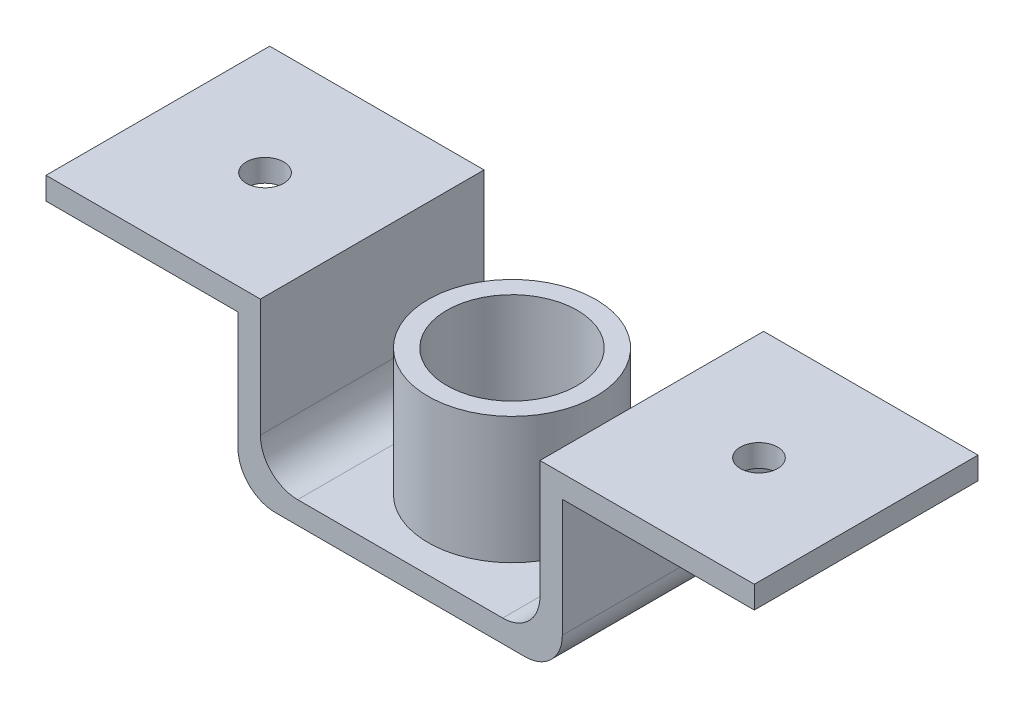
ISO-10303-21;
HEADER;
FILE_DESCRIPTION(('STEP AP214'),'2;1');
FILE_NAME('part.step','',(''),(''),'','','');
FILE_SCHEMA(('AUTOMOTIVE_DESIGN { 1 0 10303 214 1 1 1 1 }'));
ENDSEC;
DATA;
#1=APPLICATION_CONTEXT('core data for automotive mechanical design processes');
#2=APPLICATION_PROTOCOL_DEFINITION('international standard','automotive_design',2000,#1);
#3=PRODUCT_CONTEXT('',#1,'mechanical');
#4=PRODUCT('Part','Part','',(#3));
#5=PRODUCT_RELATED_PRODUCT_CATEGORY('part','',(#4));
#6=PRODUCT_DEFINITION_FORMATION('','',#4);
#7=PRODUCT_DEFINITION_CONTEXT('part definition',#1,'design');
#8=PRODUCT_DEFINITION('design','',#6,#7);
#9=PRODUCT_DEFINITION_SHAPE('','',#8);
#10=(LENGTH_UNIT() NAMED_UNIT(*) SI_UNIT(.MILLI.,.METRE.));
#11=(NAMED_UNIT(*) PLANE_ANGLE_UNIT() SI_UNIT($,.RADIAN.));
#12=(NAMED_UNIT(*) SI_UNIT($,.STERADIAN.) SOLID_ANGLE_UNIT());
#13=UNCERTAINTY_MEASURE_WITH_UNIT(LENGTH_MEASURE(1.E-05),#10,'distance_accuracy_value','');
#14=(GEOMETRIC_REPRESENTATION_CONTEXT(3) GLOBAL_UNCERTAINTY_ASSIGNED_CONTEXT((#13)) GLOBAL_UNIT_ASSIGNED_CONTEXT((#10,
#11,#12)) REPRESENTATION_CONTEXT('',''));
#15=CARTESIAN_POINT('',(0.,0.,0.));
#16=DIRECTION('',(0.,0.,1.));
#17=DIRECTION('',(1.,0.,0.));
#18=AXIS2_PLACEMENT_3D('',#15,#16,#17);
#19=CARTESIAN_POINT('',(475.,-38.,150.));
#20=DIRECTION('',(0.,-1.,0.));
#21=DIRECTION('',(0.,0.,-1.));
#22=AXIS2_PLACEMENT_3D('',#19,#20,#21);
#23=CYLINDRICAL_SURFACE('',#22,112.5);
#24=CARTESIAN_POINT('',(475.,-38.,150.));
#25=DIRECTION('',(0.,-1.,0.));
#26=DIRECTION('',(0.,0.,-1.));
#27=AXIS2_PLACEMENT_3D('',#24,#25,#26);
#28=CIRCLE('',#27,112.5);
#29=CARTESIAN_POINT('',(475.,-38.,37.5));
#30=VERTEX_POINT('',#29);
#31=EDGE_CURVE('E12',#30,#30,#28,.T.);
#32=ORIENTED_EDGE('',*,*,#31,.T.);
#33=EDGE_LOOP('',(#32));
#34=FACE_BOUND('',#33,.T.);
#35=CARTESIAN_POINT('',(475.,-208.,150.));
#36=DIRECTION('',(0.,-1.,0.));
#37=DIRECTION('',(0.,0.,-1.));
#38=AXIS2_PLACEMENT_3D('',#35,#36,#37);
#39=CIRCLE('',#38,112.5);
#40=CARTESIAN_POINT('',(475.,-208.,37.5));
#41=VERTEX_POINT('',#40);
#42=EDGE_CURVE('E50',#41,#41,#39,.T.);
#43=ORIENTED_EDGE('',*,*,#42,.F.);
#44=EDGE_LOOP('',(#43));
#45=FACE_BOUND('',#44,.T.);
#46=ADVANCED_FACE('F47',(#34,#45),#23,.T.);
#47=CARTESIAN_POINT('',(475.,-38.,150.));
#48=DIRECTION('',(0.,-1.,0.));
#49=DIRECTION('',(0.,0.,-1.));
#50=AXIS2_PLACEMENT_3D('',#47,#48,#49);
#51=PLANE('',#50);
#52=CARTESIAN_POINT('',(475.,-38.,150.));
#53=DIRECTION('',(0.,-1.,0.));
#54=DIRECTION('',(0.,0.,-1.));
#55=AXIS2_PLACEMENT_3D('',#52,#53,#54);
#56=CIRCLE('',#55,87.5);
#57=CARTESIAN_POINT('',(475.,-38.,62.5));
#58=VERTEX_POINT('',#57);
#59=EDGE_CURVE('E57',#58,#58,#56,.T.);
#60=ORIENTED_EDGE('',*,*,#59,.T.);
#61=EDGE_LOOP('',(#60));
#62=FACE_BOUND('',#61,.T.);
#63=ORIENTED_EDGE('',*,*,#31,.F.);
#64=EDGE_LOOP('',(#63));
#65=FACE_BOUND('',#64,.T.);
#66=ADVANCED_FACE('F65',(#62,#65),#51,.F.);
#67=CARTESIAN_POINT('',(475.,-208.,150.));
#68=DIRECTION('',(0.,-1.,0.));
#69=DIRECTION('',(0.,0.,-1.));
#70=AXIS2_PLACEMENT_3D('',#67,#68,#69);
#71=PLANE('',#70);
#72=CARTESIAN_POINT('',(475.,-208.,150.));
#73=DIRECTION('',(0.,-1.,0.));
#74=DIRECTION('',(0.,0.,-1.));
#75=AXIS2_PLACEMENT_3D('',#72,#73,#74);
#76=CIRCLE('',#75,87.5);
#77=CARTESIAN_POINT('',(475.,-208.,62.5));
#78=VERTEX_POINT('',#77);
#79=EDGE_CURVE('E59',#78,#78,#76,.T.);
#80=ORIENTED_EDGE('',*,*,#79,.F.);
#81=EDGE_LOOP('',(#80));
#82=FACE_BOUND('',#81,.T.);
#83=ORIENTED_EDGE('',*,*,#42,.T.);
#84=EDGE_LOOP('',(#83));
#85=FACE_BOUND('',#84,.T.);
#86=ADVANCED_FACE('F71',(#82,#85),#71,.T.);
#87=CARTESIAN_POINT('',(475.,-38.,150.));
#88=DIRECTION('',(0.,-1.,0.));
#89=DIRECTION('',(0.,0.,-1.));
#90=AXIS2_PLACEMENT_3D('',#87,#88,#89);
#91=CYLINDRICAL_SURFACE('',#90,87.5);
#92=ORIENTED_EDGE('',*,*,#59,.F.);
#93=EDGE_LOOP('',(#92));
#94=FACE_BOUND('',#93,.T.);
#95=ORIENTED_EDGE('',*,*,#79,.T.);
#96=EDGE_LOOP('',(#95));
#97=FACE_BOUND('',#96,.T.);
#98=ADVANCED_FACE('F68',(#94,#97),#91,.F.);
#99=CLOSED_SHELL('',(#46,#66,#86,#98));
#100=MANIFOLD_SOLID_BREP('B2',#99);
#101=CARTESIAN_POINT('',(0.,0.,300.));
#102=DIRECTION('',(1.,0.,0.));
#103=DIRECTION('',(0.,0.,-1.));
#104=AXIS2_PLACEMENT_3D('',#101,#102,#103);
#105=PLANE('',#104);
#106=DIRECTION('',(0.,-1.,0.));
#107=VECTOR('',#106,1.);
#108=CARTESIAN_POINT('',(0.,0.,0.));
#109=LINE('',#108,#107);
#110=CARTESIAN_POINT('',(0.,0.,0.));
#111=VERTEX_POINT('',#110);
#112=CARTESIAN_POINT('',(0.,-30.,0.));
#113=VERTEX_POINT('',#112);
#114=EDGE_CURVE('E254',#111,#113,#109,.T.);
#115=ORIENTED_EDGE('',*,*,#114,.T.);
#116=DIRECTION('',(0.,0.,-1.));
#117=VECTOR('',#116,1.);
#118=CARTESIAN_POINT('',(0.,-30.,300.));
#119=LINE('',#118,#117);
#120=CARTESIAN_POINT('',(0.,-30.,300.));
#121=VERTEX_POINT('',#120);
#122=EDGE_CURVE('E45',#121,#113,#119,.T.);
#123=ORIENTED_EDGE('',*,*,#122,.F.);
#124=DIRECTION('',(0.,-1.,0.));
#125=VECTOR('',#124,1.);
#126=CARTESIAN_POINT('',(0.,0.,300.));
#127=LINE('',#126,#125);
#128=CARTESIAN_POINT('',(0.,0.,300.));
#129=VERTEX_POINT('',#128);
#130=EDGE_CURVE('E285',#129,#121,#127,.T.);
#131=ORIENTED_EDGE('',*,*,#130,.F.);
#132=DIRECTION('',(0.,0.,-1.));
#133=VECTOR('',#132,1.);
#134=CARTESIAN_POINT('',(0.,0.,300.));
#135=LINE('',#134,#133);
#136=EDGE_CURVE('E250',#129,#111,#135,.T.);
#137=ORIENTED_EDGE('',*,*,#136,.T.);
#138=EDGE_LOOP('',(#115,#123,#131,#137));
#139=FACE_BOUND('',#138,.T.);
#140=ADVANCED_FACE('F109',(#139),#105,.F.);
#141=CARTESIAN_POINT('',(0.,-30.,300.));
#142=DIRECTION('',(0.,1.,0.));
#143=DIRECTION('',(0.,0.,1.));
#144=AXIS2_PLACEMENT_3D('',#141,#142,#143);
#145=PLANE('',#144);
#146=CARTESIAN_POINT('',(143.75,-30.,150.));
#147=DIRECTION('',(0.,1.,0.));
#148=DIRECTION('',(0.,0.,1.));
#149=AXIS2_PLACEMENT_3D('',#146,#147,#148);
#150=CIRCLE('',#149,25.);
#151=CARTESIAN_POINT('',(143.75,-30.,175.));
#152=VERTEX_POINT('',#151);
#153=EDGE_CURVE('E539',#152,#152,#150,.T.);
#154=ORIENTED_EDGE('',*,*,#153,.T.);
#155=EDGE_LOOP('',(#154));
#156=FACE_BOUND('',#155,.T.);
#157=DIRECTION('',(1.,0.,0.));
#158=VECTOR('',#157,1.);
#159=CARTESIAN_POINT('',(0.,-30.,0.));
#160=LINE('',#159,#158);
#161=CARTESIAN_POINT('',(257.5,-30.,0.));
#162=VERTEX_POINT('',#161);
#163=EDGE_CURVE('E257',#113,#162,#160,.T.);
#164=ORIENTED_EDGE('',*,*,#163,.T.);
#165=DIRECTION('',(0.,0.,-1.));
#166=VECTOR('',#165,1.);
#167=CARTESIAN_POINT('',(257.5,-30.,300.));
#168=LINE('',#167,#166);
#169=CARTESIAN_POINT('',(257.5,-30.,300.));
#170=VERTEX_POINT('',#169);
#171=EDGE_CURVE('E118',#170,#162,#168,.T.);
#172=ORIENTED_EDGE('',*,*,#171,.F.);
#173=DIRECTION('',(1.,0.,0.));
#174=VECTOR('',#173,1.);
#175=CARTESIAN_POINT('',(0.,-30.,300.));
#176=LINE('',#175,#174);
#177=EDGE_CURVE('E193',#121,#170,#176,.T.);
#178=ORIENTED_EDGE('',*,*,#177,.F.);
#179=ORIENTED_EDGE('',*,*,#122,.T.);
#180=EDGE_LOOP('',(#164,#172,#178,#179));
#181=FACE_BOUND('',#180,.T.);
#182=ADVANCED_FACE('F386',(#156,#181),#145,.F.);
#183=CARTESIAN_POINT('',(257.5,-30.,300.));
#184=DIRECTION('',(1.,0.,0.));
#185=DIRECTION('',(0.,1.,0.));
#186=AXIS2_PLACEMENT_3D('',#183,#184,#185);
#187=PLANE('',#186);
#188=DIRECTION('',(0.,-1.,0.));
#189=VECTOR('',#188,1.);
#190=CARTESIAN_POINT('',(257.5,-30.,0.));
#191=LINE('',#190,#189);
#192=CARTESIAN_POINT('',(257.5,-188.,0.));
#193=VERTEX_POINT('',#192);
#194=EDGE_CURVE('E260',#162,#193,#191,.T.);
#195=ORIENTED_EDGE('',*,*,#194,.T.);
#196=DIRECTION('',(0.,0.,-1.));
#197=VECTOR('',#196,1.);
#198=CARTESIAN_POINT('',(257.5,-188.,300.));
#199=LINE('',#198,#197);
#200=CARTESIAN_POINT('',(257.5,-188.,300.));
#201=VERTEX_POINT('',#200);
#202=EDGE_CURVE('E316',#201,#193,#199,.T.);
#203=ORIENTED_EDGE('',*,*,#202,.F.);
#204=DIRECTION('',(0.,-1.,0.));
#205=VECTOR('',#204,1.);
#206=CARTESIAN_POINT('',(257.5,-30.,300.));
#207=LINE('',#206,#205);
#208=EDGE_CURVE('E325',#170,#201,#207,.T.);
#209=ORIENTED_EDGE('',*,*,#208,.F.);
#210=ORIENTED_EDGE('',*,*,#171,.T.);
#211=EDGE_LOOP('',(#195,#203,#209,#210));
#212=FACE_BOUND('',#211,.T.);
#213=ADVANCED_FACE('F323',(#212),#187,.F.);
#214=CARTESIAN_POINT('',(307.5,-188.,300.));
#215=DIRECTION('',(0.,0.,-1.));
#216=DIRECTION('',(-1.,0.,0.));
#217=AXIS2_PLACEMENT_3D('',#214,#215,#216);
#218=CYLINDRICAL_SURFACE('',#217,50.);
#219=CARTESIAN_POINT('',(307.5,-188.,0.));
#220=DIRECTION('',(0.,0.,1.));
#221=DIRECTION('',(1.,0.,0.));
#222=AXIS2_PLACEMENT_3D('',#219,#220,#221);
#223=CIRCLE('',#222,50.);
#224=CARTESIAN_POINT('',(307.5,-238.,0.));
#225=VERTEX_POINT('',#224);
#226=EDGE_CURVE('E262',#193,#225,#223,.T.);
#227=ORIENTED_EDGE('',*,*,#226,.T.);
#228=DIRECTION('',(0.,0.,-1.));
#229=VECTOR('',#228,1.);
#230=CARTESIAN_POINT('',(307.5,-238.,300.));
#231=LINE('',#230,#229);
#232=CARTESIAN_POINT('',(307.5,-238.,300.));
#233=VERTEX_POINT('',#232);
#234=EDGE_CURVE('E313',#233,#225,#231,.T.);
#235=ORIENTED_EDGE('',*,*,#234,.F.);
#236=CARTESIAN_POINT('',(307.5,-188.,300.));
#237=DIRECTION('',(0.,0.,1.));
#238=DIRECTION('',(1.,0.,0.));
#239=AXIS2_PLACEMENT_3D('',#236,#237,#238);
#240=CIRCLE('',#239,50.);
#241=EDGE_CURVE('E343',#201,#233,#240,.T.);
#242=ORIENTED_EDGE('',*,*,#241,.F.);
#243=ORIENTED_EDGE('',*,*,#202,.T.);
#244=EDGE_LOOP('',(#227,#235,#242,#243));
#245=FACE_BOUND('',#244,.T.);
#246=ADVANCED_FACE('F334',(#245),#218,.T.);
#247=CARTESIAN_POINT('',(307.5,-238.,300.));
#248=DIRECTION('',(0.,1.,0.));
#249=DIRECTION('',(0.,0.,1.));
#250=AXIS2_PLACEMENT_3D('',#247,#248,#249);
#251=PLANE('',#250);
#252=CARTESIAN_POINT('',(475.,-238.,150.));
#253=DIRECTION('',(0.,1.,0.));
#254=DIRECTION('',(0.,0.,1.));
#255=AXIS2_PLACEMENT_3D('',#252,#253,#254);
#256=CIRCLE('',#255,37.5);
#257=CARTESIAN_POINT('',(475.,-238.,187.5));
#258=VERTEX_POINT('',#257);
#259=EDGE_CURVE('E529',#258,#258,#256,.T.);
#260=ORIENTED_EDGE('',*,*,#259,.T.);
#261=EDGE_LOOP('',(#260));
#262=FACE_BOUND('',#261,.T.);
#263=DIRECTION('',(1.,0.,0.));
#264=VECTOR('',#263,1.);
#265=CARTESIAN_POINT('',(307.5,-238.,0.));
#266=LINE('',#265,#264);
#267=CARTESIAN_POINT('',(642.5,-238.,0.));
#268=VERTEX_POINT('',#267);
#269=EDGE_CURVE('E264',#225,#268,#266,.T.);
#270=ORIENTED_EDGE('',*,*,#269,.T.);
#271=DIRECTION('',(0.,0.,-1.));
#272=VECTOR('',#271,1.);
#273=CARTESIAN_POINT('',(642.5,-238.,300.));
#274=LINE('',#273,#272);
#275=CARTESIAN_POINT('',(642.5,-238.,300.));
#276=VERTEX_POINT('',#275);
#277=EDGE_CURVE('E310',#276,#268,#274,.T.);
#278=ORIENTED_EDGE('',*,*,#277,.F.);
#279=DIRECTION('',(1.,0.,0.));
#280=VECTOR('',#279,1.);
#281=CARTESIAN_POINT('',(307.5,-238.,300.));
#282=LINE('',#281,#280);
#283=EDGE_CURVE('E340',#233,#276,#282,.T.);
#284=ORIENTED_EDGE('',*,*,#283,.F.);
#285=ORIENTED_EDGE('',*,*,#234,.T.);
#286=EDGE_LOOP('',(#270,#278,#284,#285));
#287=FACE_BOUND('',#286,.T.);
#288=ADVANCED_FACE('F338',(#262,#287),#251,.F.);
#289=CARTESIAN_POINT('',(642.5,-188.,300.));
#290=DIRECTION('',(0.,0.,-1.));
#291=DIRECTION('',(-1.,0.,0.));
#292=AXIS2_PLACEMENT_3D('',#289,#290,#291);
#293=CYLINDRICAL_SURFACE('',#292,50.);
#294=CARTESIAN_POINT('',(642.5,-188.,0.));
#295=DIRECTION('',(0.,0.,1.));
#296=DIRECTION('',(1.,0.,0.));
#297=AXIS2_PLACEMENT_3D('',#294,#295,#296);
#298=CIRCLE('',#297,50.);
#299=CARTESIAN_POINT('',(692.5,-188.,0.));
#300=VERTEX_POINT('',#299);
#301=EDGE_CURVE('E266',#268,#300,#298,.T.);
#302=ORIENTED_EDGE('',*,*,#301,.T.);
#303=DIRECTION('',(0.,0.,-1.));
#304=VECTOR('',#303,1.);
#305=CARTESIAN_POINT('',(692.5,-188.,300.));
#306=LINE('',#305,#304);
#307=CARTESIAN_POINT('',(692.5,-188.,300.));
#308=VERTEX_POINT('',#307);
#309=EDGE_CURVE('E307',#308,#300,#306,.T.);
#310=ORIENTED_EDGE('',*,*,#309,.F.);
#311=CARTESIAN_POINT('',(642.5,-188.,300.));
#312=DIRECTION('',(0.,0.,1.));
#313=DIRECTION('',(1.,0.,0.));
#314=AXIS2_PLACEMENT_3D('',#311,#312,#313);
#315=CIRCLE('',#314,50.);
#316=EDGE_CURVE('E342',#276,#308,#315,.T.);
#317=ORIENTED_EDGE('',*,*,#316,.F.);
#318=ORIENTED_EDGE('',*,*,#277,.T.);
#319=EDGE_LOOP('',(#302,#310,#317,#318));
#320=FACE_BOUND('',#319,.T.);
#321=ADVANCED_FACE('F401',(#320),#293,.T.);
#322=CARTESIAN_POINT('',(692.5,-188.,300.));
#323=DIRECTION('',(-1.,0.,0.));
#324=DIRECTION('',(0.,-1.,0.));
#325=AXIS2_PLACEMENT_3D('',#322,#323,#324);
#326=PLANE('',#325);
#327=DIRECTION('',(0.,1.,0.));
#328=VECTOR('',#327,1.);
#329=CARTESIAN_POINT('',(692.5,-188.,0.));
#330=LINE('',#329,#328);
#331=CARTESIAN_POINT('',(692.5,-30.,0.));
#332=VERTEX_POINT('',#331);
#333=EDGE_CURVE('E268',#300,#332,#330,.T.);
#334=ORIENTED_EDGE('',*,*,#333,.T.);
#335=DIRECTION('',(0.,0.,-1.));
#336=VECTOR('',#335,1.);
#337=CARTESIAN_POINT('',(692.5,-30.,300.));
#338=LINE('',#337,#336);
#339=CARTESIAN_POINT('',(692.5,-30.,300.));
#340=VERTEX_POINT('',#339);
#341=EDGE_CURVE('E304',#340,#332,#338,.T.);
#342=ORIENTED_EDGE('',*,*,#341,.F.);
#343=DIRECTION('',(0.,1.,0.));
#344=VECTOR('',#343,1.);
#345=CARTESIAN_POINT('',(692.5,-188.,300.));
#346=LINE('',#345,#344);
#347=EDGE_CURVE('E345',#308,#340,#346,.T.);
#348=ORIENTED_EDGE('',*,*,#347,.F.);
#349=ORIENTED_EDGE('',*,*,#309,.T.);
#350=EDGE_LOOP('',(#334,#342,#348,#349));
#351=FACE_BOUND('',#350,.T.);
#352=ADVANCED_FACE('F405',(#351),#326,.F.);
#353=CARTESIAN_POINT('',(692.5,-30.,300.));
#354=DIRECTION('',(0.,1.,0.));
#355=DIRECTION('',(0.,0.,1.));
#356=AXIS2_PLACEMENT_3D('',#353,#354,#355);
#357=PLANE('',#356);
#358=CARTESIAN_POINT('',(806.25,-30.,150.));
#359=DIRECTION('',(0.,1.,0.));
#360=DIRECTION('',(0.,0.,1.));
#361=AXIS2_PLACEMENT_3D('',#358,#359,#360);
#362=CIRCLE('',#361,25.);
#363=CARTESIAN_POINT('',(806.25,-30.,175.));
#364=VERTEX_POINT('',#363);
#365=EDGE_CURVE('E258',#364,#364,#362,.F.);
#366=ORIENTED_EDGE('',*,*,#365,.F.);
#367=EDGE_LOOP('',(#366));
#368=FACE_BOUND('',#367,.T.);
#369=DIRECTION('',(1.,0.,0.));
#370=VECTOR('',#369,1.);
#371=CARTESIAN_POINT('',(692.5,-30.,0.));
#372=LINE('',#371,#370);
#373=CARTESIAN_POINT('',(950.,-30.,0.));
#374=VERTEX_POINT('',#373);
#375=EDGE_CURVE('E270',#332,#374,#372,.T.);
#376=ORIENTED_EDGE('',*,*,#375,.T.);
#377=DIRECTION('',(0.,0.,-1.));
#378=VECTOR('',#377,1.);
#379=CARTESIAN_POINT('',(950.,-30.,300.));
#380=LINE('',#379,#378);
#381=CARTESIAN_POINT('',(950.,-30.,300.));
#382=VERTEX_POINT('',#381);
#383=EDGE_CURVE('E301',#382,#374,#380,.T.);
#384=ORIENTED_EDGE('',*,*,#383,.F.);
#385=DIRECTION('',(1.,0.,0.));
#386=VECTOR('',#385,1.);
#387=CARTESIAN_POINT('',(692.5,-30.,300.));
#388=LINE('',#387,#386);
#389=EDGE_CURVE('E351',#340,#382,#388,.T.);
#390=ORIENTED_EDGE('',*,*,#389,.F.);
#391=ORIENTED_EDGE('',*,*,#341,.T.);
#392=EDGE_LOOP('',(#376,#384,#390,#391));
#393=FACE_BOUND('',#392,.T.);
#394=ADVANCED_FACE('F409',(#368,#393),#357,.F.);
#395=CARTESIAN_POINT('',(950.,0.,300.));
#396=DIRECTION('',(-1.,0.,0.));
#397=DIRECTION('',(0.,0.,1.));
#398=AXIS2_PLACEMENT_3D('',#395,#396,#397);
#399=PLANE('',#398);
#400=DIRECTION('',(0.,1.,0.));
#401=VECTOR('',#400,1.);
#402=CARTESIAN_POINT('',(950.,0.,0.));
#403=LINE('',#402,#401);
#404=CARTESIAN_POINT('',(950.,0.,0.));
#405=VERTEX_POINT('',#404);
#406=EDGE_CURVE('E272',#374,#405,#403,.T.);
#407=ORIENTED_EDGE('',*,*,#406,.T.);
#408=DIRECTION('',(0.,0.,-1.));
#409=VECTOR('',#408,1.);
#410=CARTESIAN_POINT('',(950.,0.,300.));
#411=LINE('',#410,#409);
#412=CARTESIAN_POINT('',(950.,0.,300.));
#413=VERTEX_POINT('',#412);
#414=EDGE_CURVE('E298',#413,#405,#411,.T.);
#415=ORIENTED_EDGE('',*,*,#414,.F.);
#416=DIRECTION('',(0.,1.,0.));
#417=VECTOR('',#416,1.);
#418=CARTESIAN_POINT('',(950.,0.,300.));
#419=LINE('',#418,#417);
#420=EDGE_CURVE('E353',#382,#413,#419,.T.);
#421=ORIENTED_EDGE('',*,*,#420,.F.);
#422=ORIENTED_EDGE('',*,*,#383,.T.);
#423=EDGE_LOOP('',(#407,#415,#421,#422));
#424=FACE_BOUND('',#423,.T.);
#425=ADVANCED_FACE('F413',(#424),#399,.F.);
#426=CARTESIAN_POINT('',(662.5,0.,300.));
#427=DIRECTION('',(0.,-1.,0.));
#428=DIRECTION('',(0.,0.,-1.));
#429=AXIS2_PLACEMENT_3D('',#426,#427,#428);
#430=PLANE('',#429);
#431=CARTESIAN_POINT('',(806.25,0.,150.));
#432=DIRECTION('',(0.,1.,0.));
#433=DIRECTION('',(0.,0.,1.));
#434=AXIS2_PLACEMENT_3D('',#431,#432,#433);
#435=CIRCLE('',#434,25.);
#436=CARTESIAN_POINT('',(806.25,0.,175.));
#437=VERTEX_POINT('',#436);
#438=EDGE_CURVE('E532',#437,#437,#435,.F.);
#439=ORIENTED_EDGE('',*,*,#438,.T.);
#440=EDGE_LOOP('',(#439));
#441=FACE_BOUND('',#440,.T.);
#442=DIRECTION('',(-1.,0.,0.));
#443=VECTOR('',#442,1.);
#444=CARTESIAN_POINT('',(662.5,0.,0.));
#445=LINE('',#444,#443);
#446=CARTESIAN_POINT('',(662.5,0.,0.));
#447=VERTEX_POINT('',#446);
#448=EDGE_CURVE('E274',#405,#447,#445,.T.);
#449=ORIENTED_EDGE('',*,*,#448,.T.);
#450=DIRECTION('',(0.,0.,-1.));
#451=VECTOR('',#450,1.);
#452=CARTESIAN_POINT('',(662.5,0.,300.));
#453=LINE('',#452,#451);
#454=CARTESIAN_POINT('',(662.5,0.,300.));
#455=VERTEX_POINT('',#454);
#456=EDGE_CURVE('E295',#455,#447,#453,.T.);
#457=ORIENTED_EDGE('',*,*,#456,.F.);
#458=DIRECTION('',(-1.,0.,0.));
#459=VECTOR('',#458,1.);
#460=CARTESIAN_POINT('',(662.5,0.,300.));
#461=LINE('',#460,#459);
#462=EDGE_CURVE('E355',#413,#455,#461,.T.);
#463=ORIENTED_EDGE('',*,*,#462,.F.);
#464=ORIENTED_EDGE('',*,*,#414,.T.);
#465=EDGE_LOOP('',(#449,#457,#463,#464));
#466=FACE_BOUND('',#465,.T.);
#467=ADVANCED_FACE('F417',(#441,#466),#430,.F.);
#468=CARTESIAN_POINT('',(662.5,-158.,300.));
#469=DIRECTION('',(1.,0.,0.));
#470=DIRECTION('',(0.,1.,0.));
#471=AXIS2_PLACEMENT_3D('',#468,#469,#470);
#472=PLANE('',#471);
#473=DIRECTION('',(0.,-1.,0.));
#474=VECTOR('',#473,1.);
#475=CARTESIAN_POINT('',(662.5,-158.,0.));
#476=LINE('',#475,#474);
#477=CARTESIAN_POINT('',(662.5,-158.,0.));
#478=VERTEX_POINT('',#477);
#479=EDGE_CURVE('E276',#447,#478,#476,.T.);
#480=ORIENTED_EDGE('',*,*,#479,.T.);
#481=DIRECTION('',(0.,0.,-1.));
#482=VECTOR('',#481,1.);
#483=CARTESIAN_POINT('',(662.5,-158.,300.));
#484=LINE('',#483,#482);
#485=CARTESIAN_POINT('',(662.5,-158.,300.));
#486=VERTEX_POINT('',#485);
#487=EDGE_CURVE('E292',#486,#478,#484,.T.);
#488=ORIENTED_EDGE('',*,*,#487,.F.);
#489=DIRECTION('',(0.,-1.,0.));
#490=VECTOR('',#489,1.);
#491=CARTESIAN_POINT('',(662.5,-158.,300.));
#492=LINE('',#491,#490);
#493=EDGE_CURVE('E357',#455,#486,#492,.T.);
#494=ORIENTED_EDGE('',*,*,#493,.F.);
#495=ORIENTED_EDGE('',*,*,#456,.T.);
#496=EDGE_LOOP('',(#480,#488,#494,#495));
#497=FACE_BOUND('',#496,.T.);
#498=ADVANCED_FACE('F421',(#497),#472,.F.);
#499=CARTESIAN_POINT('',(612.5,-158.,300.));
#500=DIRECTION('',(0.,0.,-1.));
#501=DIRECTION('',(-1.,0.,0.));
#502=AXIS2_PLACEMENT_3D('',#499,#500,#501);
#503=CYLINDRICAL_SURFACE('',#502,50.);
#504=CARTESIAN_POINT('',(612.5,-158.,0.));
#505=DIRECTION('',(0.,0.,-1.));
#506=DIRECTION('',(1.,0.,0.));
#507=AXIS2_PLACEMENT_3D('',#504,#505,#506);
#508=CIRCLE('',#507,50.);
#509=CARTESIAN_POINT('',(612.5,-208.,0.));
#510=VERTEX_POINT('',#509);
#511=EDGE_CURVE('E278',#478,#510,#508,.T.);
#512=ORIENTED_EDGE('',*,*,#511,.T.);
#513=DIRECTION('',(0.,0.,-1.));
#514=VECTOR('',#513,1.);
#515=CARTESIAN_POINT('',(612.5,-208.,300.));
#516=LINE('',#515,#514);
#517=CARTESIAN_POINT('',(612.5,-208.,300.));
#518=VERTEX_POINT('',#517);
#519=EDGE_CURVE('E289',#518,#510,#516,.T.);
#520=ORIENTED_EDGE('',*,*,#519,.F.);
#521=CARTESIAN_POINT('',(612.5,-158.,300.));
#522=DIRECTION('',(0.,0.,-1.));
#523=DIRECTION('',(1.,0.,0.));
#524=AXIS2_PLACEMENT_3D('',#521,#522,#523);
#525=CIRCLE('',#524,50.);
#526=EDGE_CURVE('E359',#486,#518,#525,.T.);
#527=ORIENTED_EDGE('',*,*,#526,.F.);
#528=ORIENTED_EDGE('',*,*,#487,.T.);
#529=EDGE_LOOP('',(#512,#520,#527,#528));
#530=FACE_BOUND('',#529,.T.);
#531=ADVANCED_FACE('F365',(#530),#503,.F.);
#532=CARTESIAN_POINT('',(337.5,-208.,300.));
#533=DIRECTION('',(0.,-1.,0.));
#534=DIRECTION('',(0.,0.,-1.));
#535=AXIS2_PLACEMENT_3D('',#532,#533,#534);
#536=PLANE('',#535);
#537=CARTESIAN_POINT('',(475.,-208.,150.));
#538=DIRECTION('',(0.,-1.,0.));
#539=DIRECTION('',(0.,0.,-1.));
#540=AXIS2_PLACEMENT_3D('',#537,#538,#539);
#541=CIRCLE('',#540,37.5);
#542=CARTESIAN_POINT('',(475.,-208.,112.5));
#543=VERTEX_POINT('',#542);
#544=EDGE_CURVE('E112',#543,#543,#541,.T.);
#545=ORIENTED_EDGE('',*,*,#544,.T.);
#546=EDGE_LOOP('',(#545));
#547=FACE_BOUND('',#546,.T.);
#548=DIRECTION('',(-1.,0.,0.));
#549=VECTOR('',#548,1.);
#550=CARTESIAN_POINT('',(337.5,-208.,0.));
#551=LINE('',#550,#549);
#552=CARTESIAN_POINT('',(337.5,-208.,0.));
#553=VERTEX_POINT('',#552);
#554=EDGE_CURVE('E280',#510,#553,#551,.T.);
#555=ORIENTED_EDGE('',*,*,#554,.T.);
#556=DIRECTION('',(0.,0.,-1.));
#557=VECTOR('',#556,1.);
#558=CARTESIAN_POINT('',(337.5,-208.,300.));
#559=LINE('',#558,#557);
#560=CARTESIAN_POINT('',(337.5,-208.,300.));
#561=VERTEX_POINT('',#560);
#562=EDGE_CURVE('E245',#561,#553,#559,.T.);
#563=ORIENTED_EDGE('',*,*,#562,.F.);
#564=DIRECTION('',(-1.,0.,0.));
#565=VECTOR('',#564,1.);
#566=CARTESIAN_POINT('',(337.5,-208.,300.));
#567=LINE('',#566,#565);
#568=EDGE_CURVE('E236',#518,#561,#567,.T.);
#569=ORIENTED_EDGE('',*,*,#568,.F.);
#570=ORIENTED_EDGE('',*,*,#519,.T.);
#571=EDGE_LOOP('',(#555,#563,#569,#570));
#572=FACE_BOUND('',#571,.T.);
#573=ADVANCED_FACE('F369',(#547,#572),#536,.F.);
#574=CARTESIAN_POINT('',(337.5,-158.,300.));
#575=DIRECTION('',(0.,0.,-1.));
#576=DIRECTION('',(-1.,0.,0.));
#577=AXIS2_PLACEMENT_3D('',#574,#575,#576);
#578=CYLINDRICAL_SURFACE('',#577,50.);
#579=CARTESIAN_POINT('',(337.5,-158.,0.));
#580=DIRECTION('',(0.,0.,-1.));
#581=DIRECTION('',(1.,0.,0.));
#582=AXIS2_PLACEMENT_3D('',#579,#580,#581);
#583=CIRCLE('',#582,50.);
#584=CARTESIAN_POINT('',(287.5,-158.,0.));
#585=VERTEX_POINT('',#584);
#586=EDGE_CURVE('E244',#553,#585,#583,.T.);
#587=ORIENTED_EDGE('',*,*,#586,.T.);
#588=DIRECTION('',(0.,0.,-1.));
#589=VECTOR('',#588,1.);
#590=CARTESIAN_POINT('',(287.5,-158.,300.));
#591=LINE('',#590,#589);
#592=CARTESIAN_POINT('',(287.5,-158.,300.));
#593=VERTEX_POINT('',#592);
#594=EDGE_CURVE('E241',#593,#585,#591,.T.);
#595=ORIENTED_EDGE('',*,*,#594,.F.);
#596=CARTESIAN_POINT('',(337.5,-158.,300.));
#597=DIRECTION('',(0.,0.,-1.));
#598=DIRECTION('',(1.,0.,0.));
#599=AXIS2_PLACEMENT_3D('',#596,#597,#598);
#600=CIRCLE('',#599,50.);
#601=EDGE_CURVE('E230',#561,#593,#600,.T.);
#602=ORIENTED_EDGE('',*,*,#601,.F.);
#603=ORIENTED_EDGE('',*,*,#562,.T.);
#604=EDGE_LOOP('',(#587,#595,#602,#603));
#605=FACE_BOUND('',#604,.T.);
#606=ADVANCED_FACE('F242',(#605),#578,.F.);
#607=CARTESIAN_POINT('',(287.5,0.,300.));
#608=DIRECTION('',(-1.,0.,0.));
#609=DIRECTION('',(0.,-1.,0.));
#610=AXIS2_PLACEMENT_3D('',#607,#608,#609);
#611=PLANE('',#610);
#612=DIRECTION('',(0.,1.,0.));
#613=VECTOR('',#612,1.);
#614=CARTESIAN_POINT('',(287.5,0.,0.));
#615=LINE('',#614,#613);
#616=CARTESIAN_POINT('',(287.5,0.,0.));
#617=VERTEX_POINT('',#616);
#618=EDGE_CURVE('E179',#585,#617,#615,.T.);
#619=ORIENTED_EDGE('',*,*,#618,.T.);
#620=DIRECTION('',(0.,0.,-1.));
#621=VECTOR('',#620,1.);
#622=CARTESIAN_POINT('',(287.5,0.,300.));
#623=LINE('',#622,#621);
#624=CARTESIAN_POINT('',(287.5,0.,300.));
#625=VERTEX_POINT('',#624);
#626=EDGE_CURVE('E246',#625,#617,#623,.T.);
#627=ORIENTED_EDGE('',*,*,#626,.F.);
#628=DIRECTION('',(0.,1.,0.));
#629=VECTOR('',#628,1.);
#630=CARTESIAN_POINT('',(287.5,0.,300.));
#631=LINE('',#630,#629);
#632=EDGE_CURVE('E234',#593,#625,#631,.T.);
#633=ORIENTED_EDGE('',*,*,#632,.F.);
#634=ORIENTED_EDGE('',*,*,#594,.T.);
#635=EDGE_LOOP('',(#619,#627,#633,#634));
#636=FACE_BOUND('',#635,.T.);
#637=ADVANCED_FACE('F248',(#636),#611,.F.);
#638=CARTESIAN_POINT('',(0.,0.,300.));
#639=DIRECTION('',(0.,-1.,0.));
#640=DIRECTION('',(0.,0.,-1.));
#641=AXIS2_PLACEMENT_3D('',#638,#639,#640);
#642=PLANE('',#641);
#643=CARTESIAN_POINT('',(143.75,0.,150.));
#644=DIRECTION('',(0.,1.,0.));
#645=DIRECTION('',(0.,0.,1.));
#646=AXIS2_PLACEMENT_3D('',#643,#644,#645);
#647=CIRCLE('',#646,25.);
#648=CARTESIAN_POINT('',(143.75,0.,175.));
#649=VERTEX_POINT('',#648);
#650=EDGE_CURVE('E534',#649,#649,#647,.T.);
#651=ORIENTED_EDGE('',*,*,#650,.F.);
#652=EDGE_LOOP('',(#651));
#653=FACE_BOUND('',#652,.T.);
#654=DIRECTION('',(-1.,0.,0.));
#655=VECTOR('',#654,1.);
#656=CARTESIAN_POINT('',(0.,0.,0.));
#657=LINE('',#656,#655);
#658=EDGE_CURVE('E185',#617,#111,#657,.T.);
#659=ORIENTED_EDGE('',*,*,#658,.T.);
#660=ORIENTED_EDGE('',*,*,#136,.F.);
#661=DIRECTION('',(-1.,0.,0.));
#662=VECTOR('',#661,1.);
#663=CARTESIAN_POINT('',(0.,0.,300.));
#664=LINE('',#663,#662);
#665=EDGE_CURVE('E126',#625,#129,#664,.T.);
#666=ORIENTED_EDGE('',*,*,#665,.F.);
#667=ORIENTED_EDGE('',*,*,#626,.T.);
#668=EDGE_LOOP('',(#659,#660,#666,#667));
#669=FACE_BOUND('',#668,.T.);
#670=ADVANCED_FACE('F373',(#653,#669),#642,.F.);
#671=CARTESIAN_POINT('',(307.5,-188.,300.));
#672=DIRECTION('',(0.,0.,1.));
#673=DIRECTION('',(1.,0.,0.));
#674=AXIS2_PLACEMENT_3D('',#671,#672,#673);
#675=PLANE('',#674);
#676=ORIENTED_EDGE('',*,*,#130,.T.);
#677=ORIENTED_EDGE('',*,*,#177,.T.);
#678=ORIENTED_EDGE('',*,*,#208,.T.);
#679=ORIENTED_EDGE('',*,*,#241,.T.);
#680=ORIENTED_EDGE('',*,*,#283,.T.);
#681=ORIENTED_EDGE('',*,*,#316,.T.);
#682=ORIENTED_EDGE('',*,*,#347,.T.);
#683=ORIENTED_EDGE('',*,*,#389,.T.);
#684=ORIENTED_EDGE('',*,*,#420,.T.);
#685=ORIENTED_EDGE('',*,*,#462,.T.);
#686=ORIENTED_EDGE('',*,*,#493,.T.);
#687=ORIENTED_EDGE('',*,*,#526,.T.);
#688=ORIENTED_EDGE('',*,*,#568,.T.);
#689=ORIENTED_EDGE('',*,*,#601,.T.);
#690=ORIENTED_EDGE('',*,*,#632,.T.);
#691=ORIENTED_EDGE('',*,*,#665,.T.);
#692=EDGE_LOOP('',(#676,#677,#678,#679,#680,#681,#682,#683,#684,#685,#686,#687,#688,#689,#690,#691));
#693=FACE_BOUND('',#692,.T.);
#694=ADVANCED_FACE('F232',(#693),#675,.T.);
#695=CARTESIAN_POINT('',(307.5,-188.,0.));
#696=DIRECTION('',(0.,0.,1.));
#697=DIRECTION('',(1.,0.,0.));
#698=AXIS2_PLACEMENT_3D('',#695,#696,#697);
#699=PLANE('',#698);
#700=ORIENTED_EDGE('',*,*,#114,.F.);
#701=ORIENTED_EDGE('',*,*,#658,.F.);
#702=ORIENTED_EDGE('',*,*,#618,.F.);
#703=ORIENTED_EDGE('',*,*,#586,.F.);
#704=ORIENTED_EDGE('',*,*,#554,.F.);
#705=ORIENTED_EDGE('',*,*,#511,.F.);
#706=ORIENTED_EDGE('',*,*,#479,.F.);
#707=ORIENTED_EDGE('',*,*,#448,.F.);
#708=ORIENTED_EDGE('',*,*,#406,.F.);
#709=ORIENTED_EDGE('',*,*,#375,.F.);
#710=ORIENTED_EDGE('',*,*,#333,.F.);
#711=ORIENTED_EDGE('',*,*,#301,.F.);
#712=ORIENTED_EDGE('',*,*,#269,.F.);
#713=ORIENTED_EDGE('',*,*,#226,.F.);
#714=ORIENTED_EDGE('',*,*,#194,.F.);
#715=ORIENTED_EDGE('',*,*,#163,.F.);
#716=EDGE_LOOP('',(#700,#701,#702,#703,#704,#705,#706,#707,#708,#709,#710,#711,#712,#713,#714,#715));
#717=FACE_BOUND('',#716,.T.);
#718=ADVANCED_FACE('F329',(#717),#699,.F.);
#719=CARTESIAN_POINT('',(143.75,-238.,150.));
#720=DIRECTION('',(0.,1.,0.));
#721=DIRECTION('',(0.,0.,1.));
#722=AXIS2_PLACEMENT_3D('',#719,#720,#721);
#723=CYLINDRICAL_SURFACE('',#722,25.);
#724=ORIENTED_EDGE('',*,*,#650,.T.);
#725=EDGE_LOOP('',(#724));
#726=FACE_BOUND('',#725,.T.);
#727=ORIENTED_EDGE('',*,*,#153,.F.);
#728=EDGE_LOOP('',(#727));
#729=FACE_BOUND('',#728,.T.);
#730=ADVANCED_FACE('F456',(#726,#729),#723,.F.);
#731=CARTESIAN_POINT('',(806.25,-238.,150.));
#732=DIRECTION('',(0.,1.,0.));
#733=DIRECTION('',(0.,0.,1.));
#734=AXIS2_PLACEMENT_3D('',#731,#732,#733);
#735=CYLINDRICAL_SURFACE('',#734,25.);
#736=ORIENTED_EDGE('',*,*,#438,.F.);
#737=EDGE_LOOP('',(#736));
#738=FACE_BOUND('',#737,.T.);
#739=ORIENTED_EDGE('',*,*,#365,.T.);
#740=EDGE_LOOP('',(#739));
#741=FACE_BOUND('',#740,.T.);
#742=ADVANCED_FACE('F489',(#738,#741),#735,.F.);
#743=CARTESIAN_POINT('',(475.,-238.,150.));
#744=DIRECTION('',(0.,1.,0.));
#745=DIRECTION('',(0.,0.,1.));
#746=AXIS2_PLACEMENT_3D('',#743,#744,#745);
#747=CYLINDRICAL_SURFACE('',#746,37.5);
#748=ORIENTED_EDGE('',*,*,#259,.F.);
#749=EDGE_LOOP('',(#748));
#750=FACE_BOUND('',#749,.T.);
#751=ORIENTED_EDGE('',*,*,#544,.F.);
#752=EDGE_LOOP('',(#751));
#753=FACE_BOUND('',#752,.T.);
#754=ADVANCED_FACE('F499',(#750,#753),#747,.F.);
#755=CLOSED_SHELL('',(#140,#182,#213,#246,#288,#321,#352,#394,#425,#467,#498,#531,#573,#606,
#637,#670,#694,#718,#730,#742,#754));
#756=MANIFOLD_SOLID_BREP('B7',#755);
#757=ADVANCED_BREP_SHAPE_REPRESENTATION('',(#18,#100,#756),#14);
#758=SHAPE_DEFINITION_REPRESENTATION(#9,#757);
ENDSEC;
END-ISO-10303-21;
